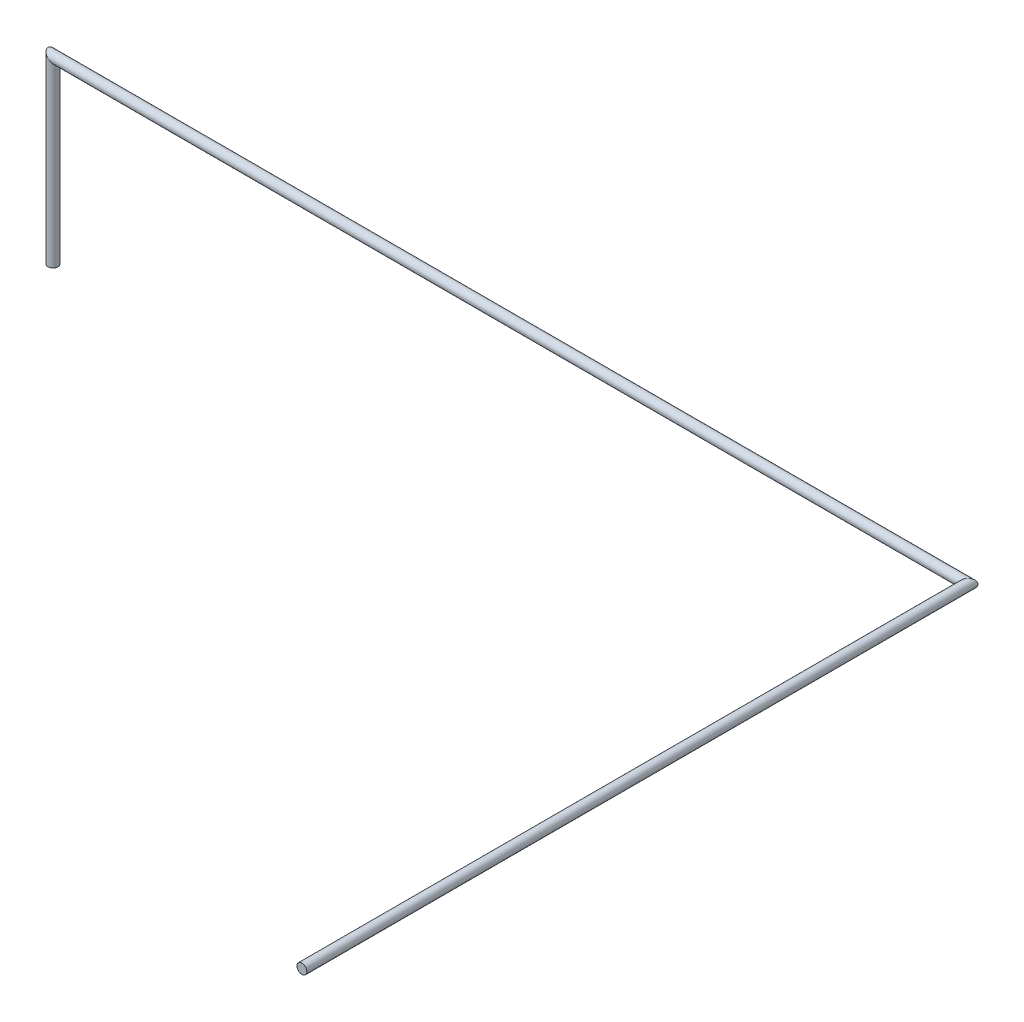
ISO-10303-21;
HEADER;
FILE_DESCRIPTION(('STEP AP214'),'2;1');
FILE_NAME('part.step','',(''),(''),'','','');
FILE_SCHEMA(('AUTOMOTIVE_DESIGN { 1 0 10303 214 1 1 1 1 }'));
ENDSEC;
DATA;
#1=APPLICATION_CONTEXT('core data for automotive mechanical design processes');
#2=APPLICATION_PROTOCOL_DEFINITION('international standard','automotive_design',2000,#1);
#3=PRODUCT_CONTEXT('',#1,'mechanical');
#4=PRODUCT('Part','Part','',(#3));
#5=PRODUCT_RELATED_PRODUCT_CATEGORY('part','',(#4));
#6=PRODUCT_DEFINITION_FORMATION('','',#4);
#7=PRODUCT_DEFINITION_CONTEXT('part definition',#1,'design');
#8=PRODUCT_DEFINITION('design','',#6,#7);
#9=PRODUCT_DEFINITION_SHAPE('','',#8);
#10=(LENGTH_UNIT() NAMED_UNIT(*) SI_UNIT(.MILLI.,.METRE.));
#11=(NAMED_UNIT(*) PLANE_ANGLE_UNIT() SI_UNIT($,.RADIAN.));
#12=(NAMED_UNIT(*) SI_UNIT($,.STERADIAN.) SOLID_ANGLE_UNIT());
#13=UNCERTAINTY_MEASURE_WITH_UNIT(LENGTH_MEASURE(1.E-05),#10,'distance_accuracy_value','');
#14=(GEOMETRIC_REPRESENTATION_CONTEXT(3) GLOBAL_UNCERTAINTY_ASSIGNED_CONTEXT((#13)) GLOBAL_UNIT_ASSIGNED_CONTEXT((#10,
#11,#12)) REPRESENTATION_CONTEXT('',''));
#15=CARTESIAN_POINT('',(0.,0.,0.));
#16=DIRECTION('',(0.,0.,1.));
#17=DIRECTION('',(1.,0.,0.));
#18=AXIS2_PLACEMENT_3D('',#15,#16,#17);
#19=CARTESIAN_POINT('',(0.,10.,0.));
#20=DIRECTION('',(0.,-1.,0.));
#21=DIRECTION('',(0.,0.,-1.));
#22=AXIS2_PLACEMENT_3D('',#19,#20,#21);
#23=CYLINDRICAL_SURFACE('',#22,12.7);
#24=CARTESIAN_POINT('',(0.,3.,0.));
#25=DIRECTION('',(0.,-1.,0.));
#26=DIRECTION('',(0.,0.,-1.));
#27=AXIS2_PLACEMENT_3D('',#24,#25,#26);
#28=CIRCLE('',#27,12.7);
#29=CARTESIAN_POINT('',(-12.686765506529,3.,0.579638665329372));
#30=VERTEX_POINT('',#29);
#31=CARTESIAN_POINT('',(-12.686765506529,3.,-0.579638665329372));
#32=VERTEX_POINT('',#31);
#33=EDGE_CURVE('E11',#30,#32,#28,.T.);
#34=ORIENTED_EDGE('',*,*,#33,.F.);
#35=DIRECTION('',(0.,-1.,0.));
#36=VECTOR('',#35,1.);
#37=CARTESIAN_POINT('',(-12.686765506529,10.,0.579638665329372));
#38=LINE('',#37,#36);
#39=CARTESIAN_POINT('',(-12.686765506529,0.,0.579638665329372));
#40=VERTEX_POINT('',#39);
#41=EDGE_CURVE('E112',#30,#40,#38,.T.);
#42=ORIENTED_EDGE('',*,*,#41,.T.);
#43=CARTESIAN_POINT('',(0.,0.,0.));
#44=DIRECTION('',(0.,1.,0.));
#45=DIRECTION('',(0.,0.,1.));
#46=AXIS2_PLACEMENT_3D('',#43,#44,#45);
#47=CIRCLE('',#46,12.7);
#48=CARTESIAN_POINT('',(-12.686765506529,0.,-0.579638665329372));
#49=VERTEX_POINT('',#48);
#50=EDGE_CURVE('E41',#40,#49,#47,.T.);
#51=ORIENTED_EDGE('',*,*,#50,.T.);
#52=DIRECTION('',(0.,-1.,0.));
#53=VECTOR('',#52,1.);
#54=CARTESIAN_POINT('',(-12.686765506529,10.,-0.579638665329372));
#55=LINE('',#54,#53);
#56=EDGE_CURVE('E48',#49,#32,#55,.F.);
#57=ORIENTED_EDGE('',*,*,#56,.T.);
#58=EDGE_LOOP('',(#34,#42,#51,#57));
#59=FACE_BOUND('',#58,.T.);
#60=CARTESIAN_POINT('',(0.,460.,0.));
#61=DIRECTION('',(0.707106781186548,0.707106781186548,0.));
#62=DIRECTION('',(-0.707106781186548,0.707106781186548,0.));
#63=AXIS2_PLACEMENT_3D('',#60,#61,#62);
#64=ELLIPSE('',#63,17.9605122421383,12.7);
#65=CARTESIAN_POINT('',(-12.7,472.7,0.));
#66=VERTEX_POINT('',#65);
#67=EDGE_CURVE('E115',#66,#66,#64,.F.);
#68=ORIENTED_EDGE('',*,*,#67,.T.);
#69=EDGE_LOOP('',(#68));
#70=FACE_BOUND('',#69,.T.);
#71=ADVANCED_FACE('F34',(#59,#70),#23,.T.);
#72=CARTESIAN_POINT('',(0.,0.,0.));
#73=DIRECTION('',(0.,1.,0.));
#74=DIRECTION('',(0.,0.,1.));
#75=AXIS2_PLACEMENT_3D('',#72,#73,#74);
#76=PLANE('',#75);
#77=ORIENTED_EDGE('',*,*,#50,.F.);
#78=DIRECTION('',(-1.,0.,0.));
#79=VECTOR('',#78,1.);
#80=CARTESIAN_POINT('',(-12.2852394828083,0.,0.579638665329372));
#81=LINE('',#80,#79);
#82=CARTESIAN_POINT('',(-13.1147605171917,0.,0.579638665329372));
#83=VERTEX_POINT('',#82);
#84=EDGE_CURVE('E102',#40,#83,#81,.T.);
#85=ORIENTED_EDGE('',*,*,#84,.T.);
#86=DIRECTION('',(0.,0.,-1.));
#87=VECTOR('',#86,1.);
#88=CARTESIAN_POINT('',(-13.1147605171917,0.,-0.579638665329372));
#89=LINE('',#88,#87);
#90=CARTESIAN_POINT('',(-13.1147605171917,0.,-0.579638665329372));
#91=VERTEX_POINT('',#90);
#92=EDGE_CURVE('E107',#83,#91,#89,.T.);
#93=ORIENTED_EDGE('',*,*,#92,.T.);
#94=DIRECTION('',(1.,0.,0.));
#95=VECTOR('',#94,1.);
#96=CARTESIAN_POINT('',(-12.2852394828083,0.,-0.579638665329372));
#97=LINE('',#96,#95);
#98=EDGE_CURVE('E85',#91,#49,#97,.T.);
#99=ORIENTED_EDGE('',*,*,#98,.T.);
#100=EDGE_LOOP('',(#77,#85,#93,#99));
#101=FACE_BOUND('',#100,.T.);
#102=ADVANCED_FACE('F124',(#101),#76,.F.);
#103=CARTESIAN_POINT('',(2335.,460.,1700.));
#104=DIRECTION('',(0.,0.,1.));
#105=DIRECTION('',(-1.,0.,0.));
#106=AXIS2_PLACEMENT_3D('',#103,#104,#105);
#107=PLANE('',#106);
#108=CARTESIAN_POINT('',(2335.,460.,1700.));
#109=DIRECTION('',(0.,0.,1.));
#110=DIRECTION('',(-1.,0.,0.));
#111=AXIS2_PLACEMENT_3D('',#108,#109,#110);
#112=CIRCLE('',#111,12.7);
#113=CARTESIAN_POINT('',(2322.3,460.,1700.));
#114=VERTEX_POINT('',#113);
#115=EDGE_CURVE('E114',#114,#114,#112,.T.);
#116=ORIENTED_EDGE('',*,*,#115,.T.);
#117=EDGE_LOOP('',(#116));
#118=FACE_BOUND('',#117,.T.);
#119=ADVANCED_FACE('F130',(#118),#107,.T.);
#120=CARTESIAN_POINT('',(2335.,460.,-14.0699999999997));
#121=DIRECTION('',(0.,0.,1.));
#122=DIRECTION('',(1.,0.,0.));
#123=AXIS2_PLACEMENT_3D('',#120,#121,#122);
#124=CYLINDRICAL_SURFACE('',#123,12.7);
#125=CARTESIAN_POINT('',(2335.,460.,0.));
#126=DIRECTION('',(0.707106781186548,0.,0.707106781186548));
#127=DIRECTION('',(0.707106781186548,0.,-0.707106781186548));
#128=AXIS2_PLACEMENT_3D('',#125,#126,#127);
#129=ELLIPSE('',#128,17.9605122421383,12.7);
#130=CARTESIAN_POINT('',(2347.7,460.,-12.7));
#131=VERTEX_POINT('',#130);
#132=EDGE_CURVE('E118',#131,#131,#129,.F.);
#133=ORIENTED_EDGE('',*,*,#132,.F.);
#134=EDGE_LOOP('',(#133));
#135=FACE_BOUND('',#134,.T.);
#136=ORIENTED_EDGE('',*,*,#115,.F.);
#137=EDGE_LOOP('',(#136));
#138=FACE_BOUND('',#137,.T.);
#139=ADVANCED_FACE('F136',(#135,#138),#124,.T.);
#140=CARTESIAN_POINT('',(-28.0399999999999,460.,0.));
#141=DIRECTION('',(1.,0.,0.));
#142=DIRECTION('',(0.,0.,-1.));
#143=AXIS2_PLACEMENT_3D('',#140,#141,#142);
#144=CYLINDRICAL_SURFACE('',#143,12.7);
#145=ORIENTED_EDGE('',*,*,#67,.F.);
#146=EDGE_LOOP('',(#145));
#147=FACE_BOUND('',#146,.T.);
#148=ORIENTED_EDGE('',*,*,#132,.T.);
#149=EDGE_LOOP('',(#148));
#150=FACE_BOUND('',#149,.T.);
#151=ADVANCED_FACE('F128',(#147,#150),#144,.T.);
#152=CARTESIAN_POINT('',(-12.2852394828083,3.,0.579638665329372));
#153=DIRECTION('',(0.,0.,1.));
#154=DIRECTION('',(1.,0.,0.));
#155=AXIS2_PLACEMENT_3D('',#152,#153,#154);
#156=PLANE('',#155);
#157=ORIENTED_EDGE('',*,*,#41,.F.);
#158=DIRECTION('',(-1.,0.,0.));
#159=VECTOR('',#158,1.);
#160=CARTESIAN_POINT('',(-12.2852394828083,3.,0.579638665329372));
#161=LINE('',#160,#159);
#162=CARTESIAN_POINT('',(-13.1147605171917,3.,0.579638665329372));
#163=VERTEX_POINT('',#162);
#164=EDGE_CURVE('E91',#30,#163,#161,.T.);
#165=ORIENTED_EDGE('',*,*,#164,.T.);
#166=DIRECTION('',(0.,-1.,0.));
#167=VECTOR('',#166,1.);
#168=CARTESIAN_POINT('',(-13.1147605171917,3.,0.579638665329372));
#169=LINE('',#168,#167);
#170=EDGE_CURVE('E90',#163,#83,#169,.T.);
#171=ORIENTED_EDGE('',*,*,#170,.T.);
#172=ORIENTED_EDGE('',*,*,#84,.F.);
#173=EDGE_LOOP('',(#157,#165,#171,#172));
#174=FACE_BOUND('',#173,.T.);
#175=ADVANCED_FACE('F126',(#174),#156,.T.);
#176=CARTESIAN_POINT('',(-12.2852394828083,3.,-0.579638665329372));
#177=DIRECTION('',(0.,0.,-1.));
#178=DIRECTION('',(-1.,0.,0.));
#179=AXIS2_PLACEMENT_3D('',#176,#177,#178);
#180=PLANE('',#179);
#181=ORIENTED_EDGE('',*,*,#56,.F.);
#182=ORIENTED_EDGE('',*,*,#98,.F.);
#183=DIRECTION('',(0.,-1.,0.));
#184=VECTOR('',#183,1.);
#185=CARTESIAN_POINT('',(-13.1147605171917,3.,-0.579638665329372));
#186=LINE('',#185,#184);
#187=CARTESIAN_POINT('',(-13.1147605171917,3.,-0.579638665329372));
#188=VERTEX_POINT('',#187);
#189=EDGE_CURVE('E80',#188,#91,#186,.T.);
#190=ORIENTED_EDGE('',*,*,#189,.F.);
#191=DIRECTION('',(1.,0.,0.));
#192=VECTOR('',#191,1.);
#193=CARTESIAN_POINT('',(-12.2852394828083,3.,-0.579638665329372));
#194=LINE('',#193,#192);
#195=EDGE_CURVE('E83',#188,#32,#194,.T.);
#196=ORIENTED_EDGE('',*,*,#195,.T.);
#197=EDGE_LOOP('',(#181,#182,#190,#196));
#198=FACE_BOUND('',#197,.T.);
#199=ADVANCED_FACE('F82',(#198),#180,.T.);
#200=CARTESIAN_POINT('',(-13.1147605171917,3.,-0.579638665329372));
#201=DIRECTION('',(-1.,0.,0.));
#202=DIRECTION('',(0.,0.,1.));
#203=AXIS2_PLACEMENT_3D('',#200,#201,#202);
#204=PLANE('',#203);
#205=ORIENTED_EDGE('',*,*,#92,.F.);
#206=ORIENTED_EDGE('',*,*,#170,.F.);
#207=DIRECTION('',(0.,0.,-1.));
#208=VECTOR('',#207,1.);
#209=CARTESIAN_POINT('',(-13.1147605171917,3.,-0.579638665329372));
#210=LINE('',#209,#208);
#211=EDGE_CURVE('E97',#163,#188,#210,.T.);
#212=ORIENTED_EDGE('',*,*,#211,.T.);
#213=ORIENTED_EDGE('',*,*,#189,.T.);
#214=EDGE_LOOP('',(#205,#206,#212,#213));
#215=FACE_BOUND('',#214,.T.);
#216=ADVANCED_FACE('F100',(#215),#204,.T.);
#217=CARTESIAN_POINT('',(0.,3.,0.));
#218=DIRECTION('',(0.,-1.,0.));
#219=DIRECTION('',(0.,0.,-1.));
#220=AXIS2_PLACEMENT_3D('',#217,#218,#219);
#221=PLANE('',#220);
#222=ORIENTED_EDGE('',*,*,#164,.F.);
#223=ORIENTED_EDGE('',*,*,#33,.T.);
#224=ORIENTED_EDGE('',*,*,#195,.F.);
#225=ORIENTED_EDGE('',*,*,#211,.F.);
#226=EDGE_LOOP('',(#222,#223,#224,#225));
#227=FACE_BOUND('',#226,.T.);
#228=ADVANCED_FACE('F96',(#227),#221,.F.);
#229=CLOSED_SHELL('',(#71,#102,#119,#139,#151,#175,#199,#216,#228));
#230=MANIFOLD_SOLID_BREP('B2',#229);
#231=ADVANCED_BREP_SHAPE_REPRESENTATION('',(#18,#230),#14);
#232=SHAPE_DEFINITION_REPRESENTATION(#9,#231);
ENDSEC;
END-ISO-10303-21;
